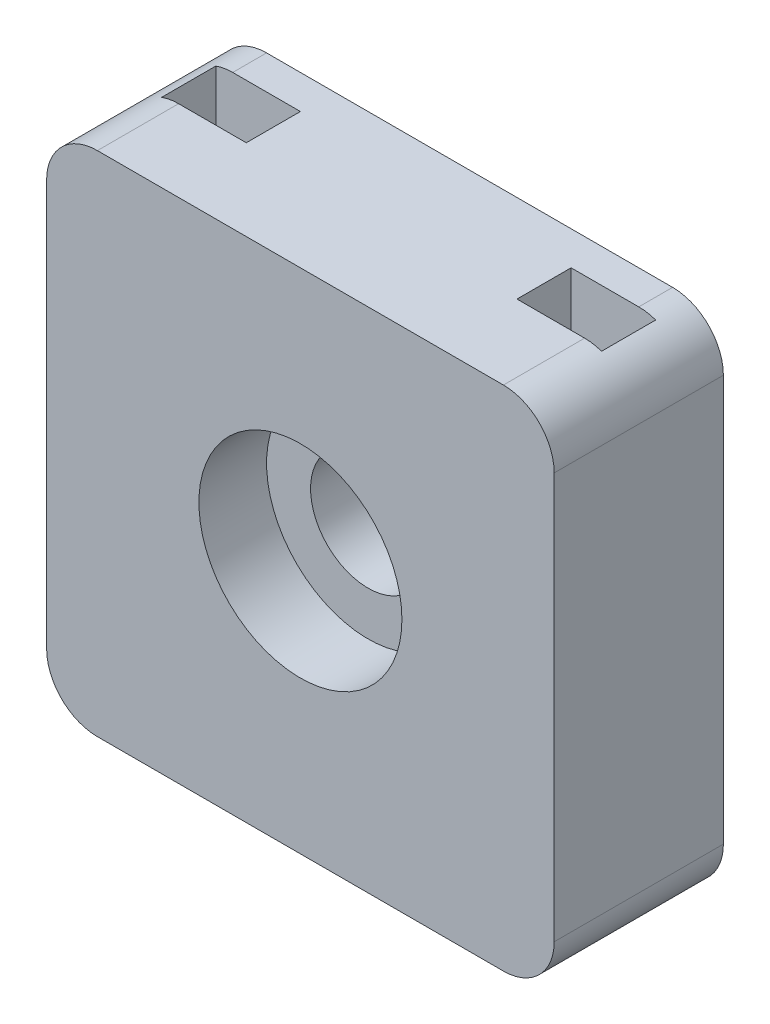
ISO-10303-21;
HEADER;
FILE_DESCRIPTION(('STEP AP214'),'2;1');
FILE_NAME('part.step','',(''),(''),'','','');
FILE_SCHEMA(('AUTOMOTIVE_DESIGN { 1 0 10303 214 1 1 1 1 }'));
ENDSEC;
DATA;
#1=APPLICATION_CONTEXT('core data for automotive mechanical design processes');
#2=APPLICATION_PROTOCOL_DEFINITION('international standard','automotive_design',2000,#1);
#3=PRODUCT_CONTEXT('',#1,'mechanical');
#4=PRODUCT('Part','Part','',(#3));
#5=PRODUCT_RELATED_PRODUCT_CATEGORY('part','',(#4));
#6=PRODUCT_DEFINITION_FORMATION('','',#4);
#7=PRODUCT_DEFINITION_CONTEXT('part definition',#1,'design');
#8=PRODUCT_DEFINITION('design','',#6,#7);
#9=PRODUCT_DEFINITION_SHAPE('','',#8);
#10=(LENGTH_UNIT() NAMED_UNIT(*) SI_UNIT(.MILLI.,.METRE.));
#11=(NAMED_UNIT(*) PLANE_ANGLE_UNIT() SI_UNIT($,.RADIAN.));
#12=(NAMED_UNIT(*) SI_UNIT($,.STERADIAN.) SOLID_ANGLE_UNIT());
#13=UNCERTAINTY_MEASURE_WITH_UNIT(LENGTH_MEASURE(1.E-05),#10,'distance_accuracy_value','');
#14=(GEOMETRIC_REPRESENTATION_CONTEXT(3) GLOBAL_UNCERTAINTY_ASSIGNED_CONTEXT((#13)) GLOBAL_UNIT_ASSIGNED_CONTEXT((#10,
#11,#12)) REPRESENTATION_CONTEXT('',''));
#15=CARTESIAN_POINT('',(0.,0.,0.));
#16=DIRECTION('',(0.,0.,1.));
#17=DIRECTION('',(1.,0.,0.));
#18=AXIS2_PLACEMENT_3D('',#15,#16,#17);
#19=CARTESIAN_POINT('',(-6.,-7.5,5.));
#20=DIRECTION('',(0.,1.,0.));
#21=DIRECTION('',(0.,0.,1.));
#22=AXIS2_PLACEMENT_3D('',#19,#20,#21);
#23=PLANE('',#22);
#24=DIRECTION('',(1.,0.,0.));
#25=VECTOR('',#24,1.);
#26=CARTESIAN_POINT('',(-6.,-7.5,1.));
#27=LINE('',#26,#25);
#28=CARTESIAN_POINT('',(-6.,-7.5,1.));
#29=VERTEX_POINT('',#28);
#30=CARTESIAN_POINT('',(-4.,-7.5,1.));
#31=VERTEX_POINT('',#30);
#32=EDGE_CURVE('E368',#29,#31,#27,.T.);
#33=ORIENTED_EDGE('',*,*,#32,.F.);
#34=DIRECTION('',(0.,0.,-1.));
#35=VECTOR('',#34,1.);
#36=CARTESIAN_POINT('',(-6.,-7.5,5.));
#37=LINE('',#36,#35);
#38=CARTESIAN_POINT('',(-6.,-7.5,0.));
#39=VERTEX_POINT('',#38);
#40=EDGE_CURVE('E229',#29,#39,#37,.T.);
#41=ORIENTED_EDGE('',*,*,#40,.T.);
#42=DIRECTION('',(1.,0.,0.));
#43=VECTOR('',#42,1.);
#44=CARTESIAN_POINT('',(-6.,-7.5,0.));
#45=LINE('',#44,#43);
#46=CARTESIAN_POINT('',(6.,-7.5,0.));
#47=VERTEX_POINT('',#46);
#48=EDGE_CURVE('E285',#39,#47,#45,.T.);
#49=ORIENTED_EDGE('',*,*,#48,.T.);
#50=DIRECTION('',(0.,0.,-1.));
#51=VECTOR('',#50,1.);
#52=CARTESIAN_POINT('',(6.,-7.5,5.));
#53=LINE('',#52,#51);
#54=CARTESIAN_POINT('',(6.,-7.5,1.));
#55=VERTEX_POINT('',#54);
#56=EDGE_CURVE('E232',#55,#47,#53,.T.);
#57=ORIENTED_EDGE('',*,*,#56,.F.);
#58=DIRECTION('',(1.,0.,0.));
#59=VECTOR('',#58,1.);
#60=CARTESIAN_POINT('',(-6.,-7.5,1.));
#61=LINE('',#60,#59);
#62=CARTESIAN_POINT('',(4.,-7.5,1.));
#63=VERTEX_POINT('',#62);
#64=EDGE_CURVE('E330',#63,#55,#61,.T.);
#65=ORIENTED_EDGE('',*,*,#64,.F.);
#66=DIRECTION('',(0.,0.,-1.));
#67=VECTOR('',#66,1.);
#68=CARTESIAN_POINT('',(4.,-7.5,5.));
#69=LINE('',#68,#67);
#70=CARTESIAN_POINT('',(4.,-7.5,2.6));
#71=VERTEX_POINT('',#70);
#72=EDGE_CURVE('E346',#71,#63,#69,.T.);
#73=ORIENTED_EDGE('',*,*,#72,.F.);
#74=DIRECTION('',(-1.,0.,0.));
#75=VECTOR('',#74,1.);
#76=CARTESIAN_POINT('',(-6.,-7.5,2.6));
#77=LINE('',#76,#75);
#78=CARTESIAN_POINT('',(6.,-7.5,2.6));
#79=VERTEX_POINT('',#78);
#80=EDGE_CURVE('E340',#79,#71,#77,.T.);
#81=ORIENTED_EDGE('',*,*,#80,.F.);
#82=CARTESIAN_POINT('',(6.,-7.5,5.));
#83=VERTEX_POINT('',#82);
#84=EDGE_CURVE('E233',#83,#79,#53,.T.);
#85=ORIENTED_EDGE('',*,*,#84,.F.);
#86=DIRECTION('',(1.,0.,0.));
#87=VECTOR('',#86,1.);
#88=CARTESIAN_POINT('',(-6.,-7.5,5.));
#89=LINE('',#88,#87);
#90=CARTESIAN_POINT('',(-6.,-7.5,5.));
#91=VERTEX_POINT('',#90);
#92=EDGE_CURVE('E310',#91,#83,#89,.T.);
#93=ORIENTED_EDGE('',*,*,#92,.F.);
#94=CARTESIAN_POINT('',(-6.,-7.5,2.6));
#95=VERTEX_POINT('',#94);
#96=EDGE_CURVE('E219',#91,#95,#37,.T.);
#97=ORIENTED_EDGE('',*,*,#96,.T.);
#98=DIRECTION('',(-1.,0.,0.));
#99=VECTOR('',#98,1.);
#100=CARTESIAN_POINT('',(-6.,-7.5,2.6));
#101=LINE('',#100,#99);
#102=CARTESIAN_POINT('',(-4.,-7.5,2.6));
#103=VERTEX_POINT('',#102);
#104=EDGE_CURVE('E380',#103,#95,#101,.T.);
#105=ORIENTED_EDGE('',*,*,#104,.F.);
#106=DIRECTION('',(0.,0.,-1.));
#107=VECTOR('',#106,1.);
#108=CARTESIAN_POINT('',(-4.,-7.5,5.));
#109=LINE('',#108,#107);
#110=EDGE_CURVE('E356',#103,#31,#109,.T.);
#111=ORIENTED_EDGE('',*,*,#110,.T.);
#112=EDGE_LOOP('',(#33,#41,#49,#57,#65,#73,#81,#85,#93,#97,#105,#111));
#113=FACE_BOUND('',#112,.T.);
#114=ADVANCED_FACE('F44',(#113),#23,.F.);
#115=CARTESIAN_POINT('',(6.,7.5,5.));
#116=DIRECTION('',(0.,-1.,0.));
#117=DIRECTION('',(0.,0.,-1.));
#118=AXIS2_PLACEMENT_3D('',#115,#116,#117);
#119=PLANE('',#118);
#120=DIRECTION('',(-1.,0.,0.));
#121=VECTOR('',#120,1.);
#122=CARTESIAN_POINT('',(6.,7.5,1.));
#123=LINE('',#122,#121);
#124=CARTESIAN_POINT('',(-4.,7.5,1.));
#125=VERTEX_POINT('',#124);
#126=CARTESIAN_POINT('',(-6.,7.5,1.));
#127=VERTEX_POINT('',#126);
#128=EDGE_CURVE('E372',#125,#127,#123,.T.);
#129=ORIENTED_EDGE('',*,*,#128,.F.);
#130=DIRECTION('',(0.,0.,1.));
#131=VECTOR('',#130,1.);
#132=CARTESIAN_POINT('',(-4.,7.5,5.));
#133=LINE('',#132,#131);
#134=CARTESIAN_POINT('',(-4.,7.5,2.6));
#135=VERTEX_POINT('',#134);
#136=EDGE_CURVE('E11',#125,#135,#133,.T.);
#137=ORIENTED_EDGE('',*,*,#136,.T.);
#138=DIRECTION('',(1.,0.,0.));
#139=VECTOR('',#138,1.);
#140=CARTESIAN_POINT('',(6.,7.5,2.6));
#141=LINE('',#140,#139);
#142=CARTESIAN_POINT('',(-6.,7.5,2.6));
#143=VERTEX_POINT('',#142);
#144=EDGE_CURVE('E385',#143,#135,#141,.T.);
#145=ORIENTED_EDGE('',*,*,#144,.F.);
#146=DIRECTION('',(0.,0.,-1.));
#147=VECTOR('',#146,1.);
#148=CARTESIAN_POINT('',(-6.,7.5,5.));
#149=LINE('',#148,#147);
#150=CARTESIAN_POINT('',(-6.,7.5,5.));
#151=VERTEX_POINT('',#150);
#152=EDGE_CURVE('E202',#151,#143,#149,.T.);
#153=ORIENTED_EDGE('',*,*,#152,.F.);
#154=DIRECTION('',(-1.,0.,0.));
#155=VECTOR('',#154,1.);
#156=CARTESIAN_POINT('',(6.,7.5,5.));
#157=LINE('',#156,#155);
#158=CARTESIAN_POINT('',(6.,7.5,5.));
#159=VERTEX_POINT('',#158);
#160=EDGE_CURVE('E294',#159,#151,#157,.T.);
#161=ORIENTED_EDGE('',*,*,#160,.F.);
#162=DIRECTION('',(0.,0.,-1.));
#163=VECTOR('',#162,1.);
#164=CARTESIAN_POINT('',(6.,7.5,5.));
#165=LINE('',#164,#163);
#166=CARTESIAN_POINT('',(6.,7.5,2.6));
#167=VERTEX_POINT('',#166);
#168=EDGE_CURVE('E242',#159,#167,#165,.T.);
#169=ORIENTED_EDGE('',*,*,#168,.T.);
#170=DIRECTION('',(1.,0.,0.));
#171=VECTOR('',#170,1.);
#172=CARTESIAN_POINT('',(6.,7.5,2.6));
#173=LINE('',#172,#171);
#174=CARTESIAN_POINT('',(4.,7.5,2.6));
#175=VERTEX_POINT('',#174);
#176=EDGE_CURVE('E211',#175,#167,#173,.T.);
#177=ORIENTED_EDGE('',*,*,#176,.F.);
#178=DIRECTION('',(0.,0.,1.));
#179=VECTOR('',#178,1.);
#180=CARTESIAN_POINT('',(4.,7.5,5.));
#181=LINE('',#180,#179);
#182=CARTESIAN_POINT('',(4.,7.5,1.));
#183=VERTEX_POINT('',#182);
#184=EDGE_CURVE('E220',#183,#175,#181,.T.);
#185=ORIENTED_EDGE('',*,*,#184,.F.);
#186=DIRECTION('',(-1.,0.,0.));
#187=VECTOR('',#186,1.);
#188=CARTESIAN_POINT('',(6.,7.5,1.));
#189=LINE('',#188,#187);
#190=CARTESIAN_POINT('',(6.,7.5,1.));
#191=VERTEX_POINT('',#190);
#192=EDGE_CURVE('E208',#191,#183,#189,.T.);
#193=ORIENTED_EDGE('',*,*,#192,.F.);
#194=CARTESIAN_POINT('',(6.,7.5,0.));
#195=VERTEX_POINT('',#194);
#196=EDGE_CURVE('E247',#191,#195,#165,.T.);
#197=ORIENTED_EDGE('',*,*,#196,.T.);
#198=DIRECTION('',(-1.,0.,0.));
#199=VECTOR('',#198,1.);
#200=CARTESIAN_POINT('',(6.,7.5,0.));
#201=LINE('',#200,#199);
#202=CARTESIAN_POINT('',(-6.,7.5,0.));
#203=VERTEX_POINT('',#202);
#204=EDGE_CURVE('E269',#195,#203,#201,.T.);
#205=ORIENTED_EDGE('',*,*,#204,.T.);
#206=EDGE_CURVE('E252',#127,#203,#149,.T.);
#207=ORIENTED_EDGE('',*,*,#206,.F.);
#208=EDGE_LOOP('',(#129,#137,#145,#153,#161,#169,#177,#185,#193,#197,#205,#207));
#209=FACE_BOUND('',#208,.T.);
#210=ADVANCED_FACE('F404',(#209),#119,.F.);
#211=CARTESIAN_POINT('',(-6.,-6.,5.));
#212=DIRECTION('',(0.,0.,-1.));
#213=DIRECTION('',(-1.,0.,0.));
#214=AXIS2_PLACEMENT_3D('',#211,#212,#213);
#215=CYLINDRICAL_SURFACE('',#214,1.5);
#216=CARTESIAN_POINT('',(-6.,-6.,1.));
#217=DIRECTION('',(0.,0.,1.));
#218=DIRECTION('',(1.,0.,0.));
#219=AXIS2_PLACEMENT_3D('',#216,#217,#218);
#220=CIRCLE('',#219,1.5);
#221=CARTESIAN_POINT('',(-6.5,-7.41421356237309,1.));
#222=VERTEX_POINT('',#221);
#223=EDGE_CURVE('E371',#222,#29,#220,.T.);
#224=ORIENTED_EDGE('',*,*,#223,.F.);
#225=DIRECTION('',(0.,0.,-1.));
#226=VECTOR('',#225,1.);
#227=CARTESIAN_POINT('',(-6.5,-7.41421356237309,5.));
#228=LINE('',#227,#226);
#229=CARTESIAN_POINT('',(-6.5,-7.41421356237309,2.6));
#230=VERTEX_POINT('',#229);
#231=EDGE_CURVE('E383',#230,#222,#228,.T.);
#232=ORIENTED_EDGE('',*,*,#231,.F.);
#233=CARTESIAN_POINT('',(-6.,-6.,2.6));
#234=DIRECTION('',(0.,0.,-1.));
#235=DIRECTION('',(-1.,0.,0.));
#236=AXIS2_PLACEMENT_3D('',#233,#234,#235);
#237=CIRCLE('',#236,1.5);
#238=EDGE_CURVE('E194',#95,#230,#237,.T.);
#239=ORIENTED_EDGE('',*,*,#238,.F.);
#240=ORIENTED_EDGE('',*,*,#96,.F.);
#241=CARTESIAN_POINT('',(-6.,-6.,5.));
#242=DIRECTION('',(0.,0.,1.));
#243=DIRECTION('',(1.,0.,0.));
#244=AXIS2_PLACEMENT_3D('',#241,#242,#243);
#245=CIRCLE('',#244,1.5);
#246=CARTESIAN_POINT('',(-7.5,-6.,5.));
#247=VERTEX_POINT('',#246);
#248=EDGE_CURVE('E262',#247,#91,#245,.T.);
#249=ORIENTED_EDGE('',*,*,#248,.F.);
#250=DIRECTION('',(0.,0.,-1.));
#251=VECTOR('',#250,1.);
#252=CARTESIAN_POINT('',(-7.5,-6.,5.));
#253=LINE('',#252,#251);
#254=CARTESIAN_POINT('',(-7.5,-6.,0.));
#255=VERTEX_POINT('',#254);
#256=EDGE_CURVE('E257',#247,#255,#253,.T.);
#257=ORIENTED_EDGE('',*,*,#256,.T.);
#258=CARTESIAN_POINT('',(-6.,-6.,0.));
#259=DIRECTION('',(0.,0.,1.));
#260=DIRECTION('',(1.,0.,0.));
#261=AXIS2_PLACEMENT_3D('',#258,#259,#260);
#262=CIRCLE('',#261,1.5);
#263=EDGE_CURVE('E286',#255,#39,#262,.T.);
#264=ORIENTED_EDGE('',*,*,#263,.T.);
#265=ORIENTED_EDGE('',*,*,#40,.F.);
#266=EDGE_LOOP('',(#224,#232,#239,#240,#249,#257,#264,#265));
#267=FACE_BOUND('',#266,.T.);
#268=ADVANCED_FACE('F50',(#267),#215,.T.);
#269=CARTESIAN_POINT('',(-6.,6.,5.));
#270=DIRECTION('',(0.,0.,-1.));
#271=DIRECTION('',(-1.,0.,0.));
#272=AXIS2_PLACEMENT_3D('',#269,#270,#271);
#273=CYLINDRICAL_SURFACE('',#272,1.5);
#274=CARTESIAN_POINT('',(-6.,6.,1.));
#275=DIRECTION('',(0.,0.,1.));
#276=DIRECTION('',(1.,0.,0.));
#277=AXIS2_PLACEMENT_3D('',#274,#275,#276);
#278=CIRCLE('',#277,1.5);
#279=CARTESIAN_POINT('',(-6.5,7.41421356237309,1.));
#280=VERTEX_POINT('',#279);
#281=EDGE_CURVE('E53',#127,#280,#278,.T.);
#282=ORIENTED_EDGE('',*,*,#281,.F.);
#283=ORIENTED_EDGE('',*,*,#206,.T.);
#284=CARTESIAN_POINT('',(-6.,6.,0.));
#285=DIRECTION('',(0.,0.,1.));
#286=DIRECTION('',(1.,0.,0.));
#287=AXIS2_PLACEMENT_3D('',#284,#285,#286);
#288=CIRCLE('',#287,1.5);
#289=CARTESIAN_POINT('',(-7.5,6.,0.));
#290=VERTEX_POINT('',#289);
#291=EDGE_CURVE('E264',#203,#290,#288,.T.);
#292=ORIENTED_EDGE('',*,*,#291,.T.);
#293=DIRECTION('',(0.,0.,-1.));
#294=VECTOR('',#293,1.);
#295=CARTESIAN_POINT('',(-7.5,6.,5.));
#296=LINE('',#295,#294);
#297=CARTESIAN_POINT('',(-7.5,6.,5.));
#298=VERTEX_POINT('',#297);
#299=EDGE_CURVE('E255',#298,#290,#296,.T.);
#300=ORIENTED_EDGE('',*,*,#299,.F.);
#301=CARTESIAN_POINT('',(-6.,6.,5.));
#302=DIRECTION('',(0.,0.,1.));
#303=DIRECTION('',(1.,0.,0.));
#304=AXIS2_PLACEMENT_3D('',#301,#302,#303);
#305=CIRCLE('',#304,1.5);
#306=EDGE_CURVE('E292',#151,#298,#305,.T.);
#307=ORIENTED_EDGE('',*,*,#306,.F.);
#308=ORIENTED_EDGE('',*,*,#152,.T.);
#309=CARTESIAN_POINT('',(-6.,6.,2.6));
#310=DIRECTION('',(0.,0.,-1.));
#311=DIRECTION('',(-1.,0.,0.));
#312=AXIS2_PLACEMENT_3D('',#309,#310,#311);
#313=CIRCLE('',#312,1.5);
#314=CARTESIAN_POINT('',(-6.5,7.41421356237309,2.6));
#315=VERTEX_POINT('',#314);
#316=EDGE_CURVE('E187',#315,#143,#313,.T.);
#317=ORIENTED_EDGE('',*,*,#316,.F.);
#318=DIRECTION('',(0.,0.,-1.));
#319=VECTOR('',#318,1.);
#320=CARTESIAN_POINT('',(-6.5,7.41421356237309,5.));
#321=LINE('',#320,#319);
#322=EDGE_CURVE('E179',#280,#315,#321,.F.);
#323=ORIENTED_EDGE('',*,*,#322,.F.);
#324=EDGE_LOOP('',(#282,#283,#292,#300,#307,#308,#317,#323));
#325=FACE_BOUND('',#324,.T.);
#326=ADVANCED_FACE('F197',(#325),#273,.T.);
#327=CARTESIAN_POINT('',(6.,-6.,5.));
#328=DIRECTION('',(0.,0.,-1.));
#329=DIRECTION('',(-1.,0.,0.));
#330=AXIS2_PLACEMENT_3D('',#327,#328,#329);
#331=CYLINDRICAL_SURFACE('',#330,1.5);
#332=CARTESIAN_POINT('',(6.,-6.,1.));
#333=DIRECTION('',(0.,0.,1.));
#334=DIRECTION('',(1.,0.,0.));
#335=AXIS2_PLACEMENT_3D('',#332,#333,#334);
#336=CIRCLE('',#335,1.5);
#337=CARTESIAN_POINT('',(6.5,-7.41421356237309,1.));
#338=VERTEX_POINT('',#337);
#339=EDGE_CURVE('E329',#55,#338,#336,.T.);
#340=ORIENTED_EDGE('',*,*,#339,.F.);
#341=ORIENTED_EDGE('',*,*,#56,.T.);
#342=CARTESIAN_POINT('',(6.,-6.,0.));
#343=DIRECTION('',(0.,0.,1.));
#344=DIRECTION('',(1.,0.,0.));
#345=AXIS2_PLACEMENT_3D('',#342,#343,#344);
#346=CIRCLE('',#345,1.5);
#347=CARTESIAN_POINT('',(7.5,-6.,0.));
#348=VERTEX_POINT('',#347);
#349=EDGE_CURVE('E276',#47,#348,#346,.T.);
#350=ORIENTED_EDGE('',*,*,#349,.T.);
#351=DIRECTION('',(0.,0.,-1.));
#352=VECTOR('',#351,1.);
#353=CARTESIAN_POINT('',(7.5,-6.,5.));
#354=LINE('',#353,#352);
#355=CARTESIAN_POINT('',(7.5,-6.,5.));
#356=VERTEX_POINT('',#355);
#357=EDGE_CURVE('E236',#356,#348,#354,.T.);
#358=ORIENTED_EDGE('',*,*,#357,.F.);
#359=CARTESIAN_POINT('',(6.,-6.,5.));
#360=DIRECTION('',(0.,0.,1.));
#361=DIRECTION('',(1.,0.,0.));
#362=AXIS2_PLACEMENT_3D('',#359,#360,#361);
#363=CIRCLE('',#362,1.5);
#364=EDGE_CURVE('E302',#83,#356,#363,.T.);
#365=ORIENTED_EDGE('',*,*,#364,.F.);
#366=ORIENTED_EDGE('',*,*,#84,.T.);
#367=CARTESIAN_POINT('',(6.,-6.,2.6));
#368=DIRECTION('',(0.,0.,-1.));
#369=DIRECTION('',(-1.,0.,0.));
#370=AXIS2_PLACEMENT_3D('',#367,#368,#369);
#371=CIRCLE('',#370,1.5);
#372=CARTESIAN_POINT('',(6.5,-7.4142135623731,2.6));
#373=VERTEX_POINT('',#372);
#374=EDGE_CURVE('E338',#373,#79,#371,.T.);
#375=ORIENTED_EDGE('',*,*,#374,.F.);
#376=DIRECTION('',(0.,0.,-1.));
#377=VECTOR('',#376,1.);
#378=CARTESIAN_POINT('',(6.5,-7.41421356237309,5.));
#379=LINE('',#378,#377);
#380=EDGE_CURVE('E318',#373,#338,#379,.T.);
#381=ORIENTED_EDGE('',*,*,#380,.T.);
#382=EDGE_LOOP('',(#340,#341,#350,#358,#365,#366,#375,#381));
#383=FACE_BOUND('',#382,.T.);
#384=ADVANCED_FACE('F450',(#383),#331,.T.);
#385=CARTESIAN_POINT('',(6.,6.,5.));
#386=DIRECTION('',(0.,0.,-1.));
#387=DIRECTION('',(-1.,0.,0.));
#388=AXIS2_PLACEMENT_3D('',#385,#386,#387);
#389=CYLINDRICAL_SURFACE('',#388,1.5);
#390=CARTESIAN_POINT('',(6.,6.,1.));
#391=DIRECTION('',(0.,0.,1.));
#392=DIRECTION('',(1.,0.,0.));
#393=AXIS2_PLACEMENT_3D('',#390,#391,#392);
#394=CIRCLE('',#393,1.5);
#395=CARTESIAN_POINT('',(6.5,7.4142135623731,1.));
#396=VERTEX_POINT('',#395);
#397=EDGE_CURVE('E333',#396,#191,#394,.T.);
#398=ORIENTED_EDGE('',*,*,#397,.F.);
#399=DIRECTION('',(0.,0.,-1.));
#400=VECTOR('',#399,1.);
#401=CARTESIAN_POINT('',(6.5,7.41421356237309,5.));
#402=LINE('',#401,#400);
#403=CARTESIAN_POINT('',(6.5,7.41421356237309,2.6));
#404=VERTEX_POINT('',#403);
#405=EDGE_CURVE('E190',#396,#404,#402,.F.);
#406=ORIENTED_EDGE('',*,*,#405,.T.);
#407=CARTESIAN_POINT('',(6.,6.,2.6));
#408=DIRECTION('',(0.,0.,-1.));
#409=DIRECTION('',(-1.,0.,0.));
#410=AXIS2_PLACEMENT_3D('',#407,#408,#409);
#411=CIRCLE('',#410,1.5);
#412=EDGE_CURVE('E344',#167,#404,#411,.T.);
#413=ORIENTED_EDGE('',*,*,#412,.F.);
#414=ORIENTED_EDGE('',*,*,#168,.F.);
#415=CARTESIAN_POINT('',(6.,6.,5.));
#416=DIRECTION('',(0.,0.,1.));
#417=DIRECTION('',(1.,0.,0.));
#418=AXIS2_PLACEMENT_3D('',#415,#416,#417);
#419=CIRCLE('',#418,1.5);
#420=CARTESIAN_POINT('',(7.5,6.,5.));
#421=VERTEX_POINT('',#420);
#422=EDGE_CURVE('E296',#421,#159,#419,.T.);
#423=ORIENTED_EDGE('',*,*,#422,.F.);
#424=DIRECTION('',(0.,0.,-1.));
#425=VECTOR('',#424,1.);
#426=CARTESIAN_POINT('',(7.5,6.,5.));
#427=LINE('',#426,#425);
#428=CARTESIAN_POINT('',(7.5,6.,0.));
#429=VERTEX_POINT('',#428);
#430=EDGE_CURVE('E239',#421,#429,#427,.T.);
#431=ORIENTED_EDGE('',*,*,#430,.T.);
#432=CARTESIAN_POINT('',(6.,6.,0.));
#433=DIRECTION('',(0.,0.,1.));
#434=DIRECTION('',(1.,0.,0.));
#435=AXIS2_PLACEMENT_3D('',#432,#433,#434);
#436=CIRCLE('',#435,1.5);
#437=EDGE_CURVE('E275',#429,#195,#436,.T.);
#438=ORIENTED_EDGE('',*,*,#437,.T.);
#439=ORIENTED_EDGE('',*,*,#196,.F.);
#440=EDGE_LOOP('',(#398,#406,#413,#414,#423,#431,#438,#439));
#441=FACE_BOUND('',#440,.T.);
#442=ADVANCED_FACE('F455',(#441),#389,.T.);
#443=CARTESIAN_POINT('',(0.,0.,5.));
#444=DIRECTION('',(0.,0.,-1.));
#445=DIRECTION('',(-1.,0.,0.));
#446=AXIS2_PLACEMENT_3D('',#443,#444,#445);
#447=CYLINDRICAL_SURFACE('',#446,1.7);
#448=CARTESIAN_POINT('',(0.,0.,0.));
#449=DIRECTION('',(0.,0.,1.));
#450=DIRECTION('',(1.,0.,0.));
#451=AXIS2_PLACEMENT_3D('',#448,#449,#450);
#452=CIRCLE('',#451,1.7);
#453=CARTESIAN_POINT('',(1.7,0.,0.));
#454=VERTEX_POINT('',#453);
#455=EDGE_CURVE('E225',#454,#454,#452,.T.);
#456=ORIENTED_EDGE('',*,*,#455,.F.);
#457=EDGE_LOOP('',(#456));
#458=FACE_BOUND('',#457,.T.);
#459=CARTESIAN_POINT('',(0.,0.,3.));
#460=DIRECTION('',(0.,0.,1.));
#461=DIRECTION('',(1.,0.,0.));
#462=AXIS2_PLACEMENT_3D('',#459,#460,#461);
#463=CIRCLE('',#462,1.7);
#464=CARTESIAN_POINT('',(1.7,0.,3.));
#465=VERTEX_POINT('',#464);
#466=EDGE_CURVE('E221',#465,#465,#463,.T.);
#467=ORIENTED_EDGE('',*,*,#466,.T.);
#468=EDGE_LOOP('',(#467));
#469=FACE_BOUND('',#468,.T.);
#470=ADVANCED_FACE('F500',(#458,#469),#447,.F.);
#471=CARTESIAN_POINT('',(7.5,-6.,5.));
#472=DIRECTION('',(-1.,0.,0.));
#473=DIRECTION('',(0.,0.,1.));
#474=AXIS2_PLACEMENT_3D('',#471,#472,#473);
#475=PLANE('',#474);
#476=DIRECTION('',(0.,1.,0.));
#477=VECTOR('',#476,1.);
#478=CARTESIAN_POINT('',(7.5,-6.,0.));
#479=LINE('',#478,#477);
#480=EDGE_CURVE('E277',#348,#429,#479,.T.);
#481=ORIENTED_EDGE('',*,*,#480,.T.);
#482=ORIENTED_EDGE('',*,*,#430,.F.);
#483=DIRECTION('',(0.,1.,0.));
#484=VECTOR('',#483,1.);
#485=CARTESIAN_POINT('',(7.5,-6.,5.));
#486=LINE('',#485,#484);
#487=EDGE_CURVE('E301',#356,#421,#486,.T.);
#488=ORIENTED_EDGE('',*,*,#487,.F.);
#489=ORIENTED_EDGE('',*,*,#357,.T.);
#490=EDGE_LOOP('',(#481,#482,#488,#489));
#491=FACE_BOUND('',#490,.T.);
#492=ADVANCED_FACE('F446',(#491),#475,.F.);
#493=CARTESIAN_POINT('',(-7.5,6.,5.));
#494=DIRECTION('',(1.,0.,0.));
#495=DIRECTION('',(0.,0.,-1.));
#496=AXIS2_PLACEMENT_3D('',#493,#494,#495);
#497=PLANE('',#496);
#498=DIRECTION('',(0.,-1.,0.));
#499=VECTOR('',#498,1.);
#500=CARTESIAN_POINT('',(-7.5,6.,0.));
#501=LINE('',#500,#499);
#502=EDGE_CURVE('E261',#290,#255,#501,.T.);
#503=ORIENTED_EDGE('',*,*,#502,.T.);
#504=ORIENTED_EDGE('',*,*,#256,.F.);
#505=DIRECTION('',(0.,-1.,0.));
#506=VECTOR('',#505,1.);
#507=CARTESIAN_POINT('',(-7.5,6.,5.));
#508=LINE('',#507,#506);
#509=EDGE_CURVE('E258',#298,#247,#508,.T.);
#510=ORIENTED_EDGE('',*,*,#509,.F.);
#511=ORIENTED_EDGE('',*,*,#299,.T.);
#512=EDGE_LOOP('',(#503,#504,#510,#511));
#513=FACE_BOUND('',#512,.T.);
#514=ADVANCED_FACE('F426',(#513),#497,.F.);
#515=CARTESIAN_POINT('',(-6.,-6.,5.));
#516=DIRECTION('',(0.,0.,1.));
#517=DIRECTION('',(1.,0.,0.));
#518=AXIS2_PLACEMENT_3D('',#515,#516,#517);
#519=PLANE('',#518);
#520=CARTESIAN_POINT('',(0.,0.,5.));
#521=DIRECTION('',(0.,0.,1.));
#522=DIRECTION('',(1.,0.,0.));
#523=AXIS2_PLACEMENT_3D('',#520,#521,#522);
#524=CIRCLE('',#523,3.);
#525=CARTESIAN_POINT('',(3.,0.,5.));
#526=VERTEX_POINT('',#525);
#527=EDGE_CURVE('E228',#526,#526,#524,.T.);
#528=ORIENTED_EDGE('',*,*,#527,.F.);
#529=EDGE_LOOP('',(#528));
#530=FACE_BOUND('',#529,.T.);
#531=ORIENTED_EDGE('',*,*,#248,.T.);
#532=ORIENTED_EDGE('',*,*,#92,.T.);
#533=ORIENTED_EDGE('',*,*,#364,.T.);
#534=ORIENTED_EDGE('',*,*,#487,.T.);
#535=ORIENTED_EDGE('',*,*,#422,.T.);
#536=ORIENTED_EDGE('',*,*,#160,.T.);
#537=ORIENTED_EDGE('',*,*,#306,.T.);
#538=ORIENTED_EDGE('',*,*,#509,.T.);
#539=EDGE_LOOP('',(#531,#532,#533,#534,#535,#536,#537,#538));
#540=FACE_BOUND('',#539,.T.);
#541=ADVANCED_FACE('F435',(#530,#540),#519,.T.);
#542=CARTESIAN_POINT('',(-6.,-6.,0.));
#543=DIRECTION('',(0.,0.,1.));
#544=DIRECTION('',(1.,0.,0.));
#545=AXIS2_PLACEMENT_3D('',#542,#543,#544);
#546=PLANE('',#545);
#547=ORIENTED_EDGE('',*,*,#455,.T.);
#548=EDGE_LOOP('',(#547));
#549=FACE_BOUND('',#548,.T.);
#550=ORIENTED_EDGE('',*,*,#263,.F.);
#551=ORIENTED_EDGE('',*,*,#502,.F.);
#552=ORIENTED_EDGE('',*,*,#291,.F.);
#553=ORIENTED_EDGE('',*,*,#204,.F.);
#554=ORIENTED_EDGE('',*,*,#437,.F.);
#555=ORIENTED_EDGE('',*,*,#480,.F.);
#556=ORIENTED_EDGE('',*,*,#349,.F.);
#557=ORIENTED_EDGE('',*,*,#48,.F.);
#558=EDGE_LOOP('',(#550,#551,#552,#553,#554,#555,#556,#557));
#559=FACE_BOUND('',#558,.T.);
#560=ADVANCED_FACE('F420',(#549,#559),#546,.F.);
#561=CARTESIAN_POINT('',(0.,0.,5.));
#562=DIRECTION('',(0.,0.,-1.));
#563=DIRECTION('',(-1.,0.,0.));
#564=AXIS2_PLACEMENT_3D('',#561,#562,#563);
#565=CYLINDRICAL_SURFACE('',#564,3.);
#566=ORIENTED_EDGE('',*,*,#527,.T.);
#567=EDGE_LOOP('',(#566));
#568=FACE_BOUND('',#567,.T.);
#569=CARTESIAN_POINT('',(0.,0.,3.));
#570=DIRECTION('',(0.,0.,1.));
#571=DIRECTION('',(1.,0.,0.));
#572=AXIS2_PLACEMENT_3D('',#569,#570,#571);
#573=CIRCLE('',#572,3.);
#574=CARTESIAN_POINT('',(3.,0.,3.));
#575=VERTEX_POINT('',#574);
#576=EDGE_CURVE('E317',#575,#575,#573,.T.);
#577=ORIENTED_EDGE('',*,*,#576,.F.);
#578=EDGE_LOOP('',(#577));
#579=FACE_BOUND('',#578,.T.);
#580=ADVANCED_FACE('F481',(#568,#579),#565,.F.);
#581=CARTESIAN_POINT('',(0.,0.,3.));
#582=DIRECTION('',(0.,0.,1.));
#583=DIRECTION('',(1.,0.,0.));
#584=AXIS2_PLACEMENT_3D('',#581,#582,#583);
#585=PLANE('',#584);
#586=ORIENTED_EDGE('',*,*,#466,.F.);
#587=EDGE_LOOP('',(#586));
#588=FACE_BOUND('',#587,.T.);
#589=ORIENTED_EDGE('',*,*,#576,.T.);
#590=EDGE_LOOP('',(#589));
#591=FACE_BOUND('',#590,.T.);
#592=ADVANCED_FACE('F474',(#588,#591),#585,.T.);
#593=CARTESIAN_POINT('',(6.5,0.,0.));
#594=DIRECTION('',(1.,0.,0.));
#595=DIRECTION('',(0.,0.,-1.));
#596=AXIS2_PLACEMENT_3D('',#593,#594,#595);
#597=PLANE('',#596);
#598=DIRECTION('',(0.,-1.,0.));
#599=VECTOR('',#598,1.);
#600=CARTESIAN_POINT('',(6.5,8.,2.6));
#601=LINE('',#600,#599);
#602=EDGE_CURVE('E347',#404,#373,#601,.T.);
#603=ORIENTED_EDGE('',*,*,#602,.F.);
#604=ORIENTED_EDGE('',*,*,#405,.F.);
#605=DIRECTION('',(0.,1.,0.));
#606=VECTOR('',#605,1.);
#607=CARTESIAN_POINT('',(6.5,-8.,1.));
#608=LINE('',#607,#606);
#609=EDGE_CURVE('E353',#338,#396,#608,.T.);
#610=ORIENTED_EDGE('',*,*,#609,.F.);
#611=ORIENTED_EDGE('',*,*,#380,.F.);
#612=EDGE_LOOP('',(#603,#604,#610,#611));
#613=FACE_BOUND('',#612,.T.);
#614=ADVANCED_FACE('F468',(#613),#597,.F.);
#615=CARTESIAN_POINT('',(6.5,-8.,1.));
#616=DIRECTION('',(0.,0.,1.));
#617=DIRECTION('',(1.,0.,0.));
#618=AXIS2_PLACEMENT_3D('',#615,#616,#617);
#619=PLANE('',#618);
#620=ORIENTED_EDGE('',*,*,#64,.T.);
#621=ORIENTED_EDGE('',*,*,#339,.T.);
#622=ORIENTED_EDGE('',*,*,#609,.T.);
#623=ORIENTED_EDGE('',*,*,#397,.T.);
#624=ORIENTED_EDGE('',*,*,#192,.T.);
#625=DIRECTION('',(0.,1.,0.));
#626=VECTOR('',#625,1.);
#627=CARTESIAN_POINT('',(4.,-8.,1.));
#628=LINE('',#627,#626);
#629=EDGE_CURVE('E355',#63,#183,#628,.T.);
#630=ORIENTED_EDGE('',*,*,#629,.F.);
#631=EDGE_LOOP('',(#620,#621,#622,#623,#624,#630));
#632=FACE_BOUND('',#631,.T.);
#633=ADVANCED_FACE('F470',(#632),#619,.T.);
#634=CARTESIAN_POINT('',(6.5,8.,2.6));
#635=DIRECTION('',(0.,0.,-1.));
#636=DIRECTION('',(-1.,0.,0.));
#637=AXIS2_PLACEMENT_3D('',#634,#635,#636);
#638=PLANE('',#637);
#639=ORIENTED_EDGE('',*,*,#80,.T.);
#640=DIRECTION('',(0.,-1.,0.));
#641=VECTOR('',#640,1.);
#642=CARTESIAN_POINT('',(4.,8.,2.6));
#643=LINE('',#642,#641);
#644=EDGE_CURVE('E349',#175,#71,#643,.T.);
#645=ORIENTED_EDGE('',*,*,#644,.F.);
#646=ORIENTED_EDGE('',*,*,#176,.T.);
#647=ORIENTED_EDGE('',*,*,#412,.T.);
#648=ORIENTED_EDGE('',*,*,#602,.T.);
#649=ORIENTED_EDGE('',*,*,#374,.T.);
#650=EDGE_LOOP('',(#639,#645,#646,#647,#648,#649));
#651=FACE_BOUND('',#650,.T.);
#652=ADVANCED_FACE('F457',(#651),#638,.T.);
#653=CARTESIAN_POINT('',(4.,0.,0.));
#654=DIRECTION('',(1.,0.,0.));
#655=DIRECTION('',(0.,0.,-1.));
#656=AXIS2_PLACEMENT_3D('',#653,#654,#655);
#657=PLANE('',#656);
#658=ORIENTED_EDGE('',*,*,#72,.T.);
#659=ORIENTED_EDGE('',*,*,#629,.T.);
#660=ORIENTED_EDGE('',*,*,#184,.T.);
#661=ORIENTED_EDGE('',*,*,#644,.T.);
#662=EDGE_LOOP('',(#658,#659,#660,#661));
#663=FACE_BOUND('',#662,.T.);
#664=ADVANCED_FACE('F464',(#663),#657,.T.);
#665=CARTESIAN_POINT('',(-4.,0.,0.));
#666=DIRECTION('',(1.,0.,0.));
#667=DIRECTION('',(0.,0.,-1.));
#668=AXIS2_PLACEMENT_3D('',#665,#666,#667);
#669=PLANE('',#668);
#670=DIRECTION('',(0.,-1.,0.));
#671=VECTOR('',#670,1.);
#672=CARTESIAN_POINT('',(-4.,8.,2.6));
#673=LINE('',#672,#671);
#674=EDGE_CURVE('E390',#135,#103,#673,.T.);
#675=ORIENTED_EDGE('',*,*,#674,.F.);
#676=ORIENTED_EDGE('',*,*,#136,.F.);
#677=DIRECTION('',(0.,1.,0.));
#678=VECTOR('',#677,1.);
#679=CARTESIAN_POINT('',(-4.,-8.,1.));
#680=LINE('',#679,#678);
#681=EDGE_CURVE('E196',#31,#125,#680,.T.);
#682=ORIENTED_EDGE('',*,*,#681,.F.);
#683=ORIENTED_EDGE('',*,*,#110,.F.);
#684=EDGE_LOOP('',(#675,#676,#682,#683));
#685=FACE_BOUND('',#684,.T.);
#686=ADVANCED_FACE('F438',(#685),#669,.F.);
#687=CARTESIAN_POINT('',(-4.,-8.,1.));
#688=DIRECTION('',(0.,0.,1.));
#689=DIRECTION('',(1.,0.,0.));
#690=AXIS2_PLACEMENT_3D('',#687,#688,#689);
#691=PLANE('',#690);
#692=ORIENTED_EDGE('',*,*,#32,.T.);
#693=ORIENTED_EDGE('',*,*,#681,.T.);
#694=ORIENTED_EDGE('',*,*,#128,.T.);
#695=ORIENTED_EDGE('',*,*,#281,.T.);
#696=DIRECTION('',(0.,1.,0.));
#697=VECTOR('',#696,1.);
#698=CARTESIAN_POINT('',(-6.5,-8.,1.));
#699=LINE('',#698,#697);
#700=EDGE_CURVE('E66',#222,#280,#699,.T.);
#701=ORIENTED_EDGE('',*,*,#700,.F.);
#702=ORIENTED_EDGE('',*,*,#223,.T.);
#703=EDGE_LOOP('',(#692,#693,#694,#695,#701,#702));
#704=FACE_BOUND('',#703,.T.);
#705=ADVANCED_FACE('F398',(#704),#691,.T.);
#706=CARTESIAN_POINT('',(-4.,8.,2.6));
#707=DIRECTION('',(0.,0.,-1.));
#708=DIRECTION('',(-1.,0.,0.));
#709=AXIS2_PLACEMENT_3D('',#706,#707,#708);
#710=PLANE('',#709);
#711=ORIENTED_EDGE('',*,*,#104,.T.);
#712=ORIENTED_EDGE('',*,*,#238,.T.);
#713=DIRECTION('',(0.,-1.,0.));
#714=VECTOR('',#713,1.);
#715=CARTESIAN_POINT('',(-6.5,8.,2.6));
#716=LINE('',#715,#714);
#717=EDGE_CURVE('E62',#315,#230,#716,.T.);
#718=ORIENTED_EDGE('',*,*,#717,.F.);
#719=ORIENTED_EDGE('',*,*,#316,.T.);
#720=ORIENTED_EDGE('',*,*,#144,.T.);
#721=ORIENTED_EDGE('',*,*,#674,.T.);
#722=EDGE_LOOP('',(#711,#712,#718,#719,#720,#721));
#723=FACE_BOUND('',#722,.T.);
#724=ADVANCED_FACE('F188',(#723),#710,.T.);
#725=CARTESIAN_POINT('',(-6.5,0.,0.));
#726=DIRECTION('',(1.,0.,0.));
#727=DIRECTION('',(0.,0.,-1.));
#728=AXIS2_PLACEMENT_3D('',#725,#726,#727);
#729=PLANE('',#728);
#730=ORIENTED_EDGE('',*,*,#231,.T.);
#731=ORIENTED_EDGE('',*,*,#700,.T.);
#732=ORIENTED_EDGE('',*,*,#322,.T.);
#733=ORIENTED_EDGE('',*,*,#717,.T.);
#734=EDGE_LOOP('',(#730,#731,#732,#733));
#735=FACE_BOUND('',#734,.T.);
#736=ADVANCED_FACE('F181',(#735),#729,.T.);
#737=CLOSED_SHELL('',(#114,#210,#268,#326,#384,#442,#470,#492,#514,#541,#560,#580,#592,#614,
#633,#652,#664,#686,#705,#724,#736));
#738=MANIFOLD_SOLID_BREP('B2',#737);
#739=ADVANCED_BREP_SHAPE_REPRESENTATION('',(#18,#738),#14);
#740=SHAPE_DEFINITION_REPRESENTATION(#9,#739);
ENDSEC;
END-ISO-10303-21;
